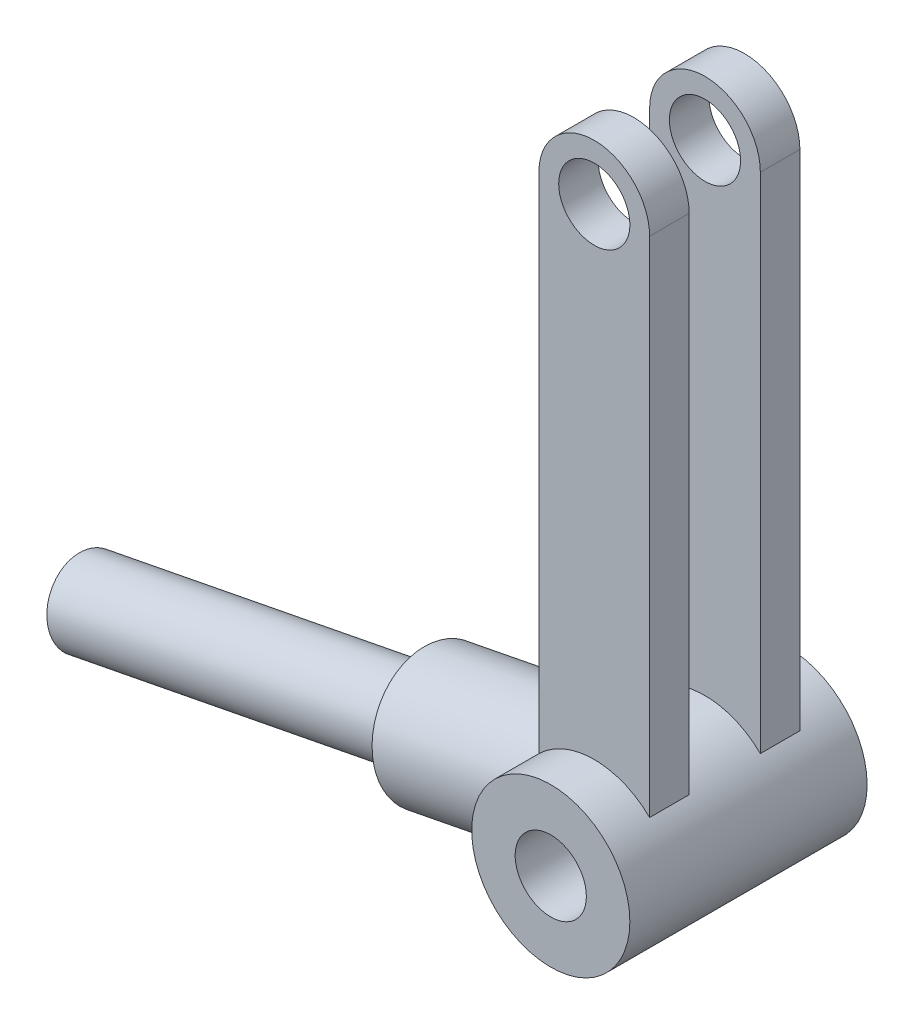
ISO-10303-21;
HEADER;
FILE_DESCRIPTION(('STEP AP214'),'2;1');
FILE_NAME('part.step','',(''),(''),'','','');
FILE_SCHEMA(('AUTOMOTIVE_DESIGN { 1 0 10303 214 1 1 1 1 }'));
ENDSEC;
DATA;
#1=APPLICATION_CONTEXT('core data for automotive mechanical design processes');
#2=APPLICATION_PROTOCOL_DEFINITION('international standard','automotive_design',2000,#1);
#3=PRODUCT_CONTEXT('',#1,'mechanical');
#4=PRODUCT('Part','Part','',(#3));
#5=PRODUCT_RELATED_PRODUCT_CATEGORY('part','',(#4));
#6=PRODUCT_DEFINITION_FORMATION('','',#4);
#7=PRODUCT_DEFINITION_CONTEXT('part definition',#1,'design');
#8=PRODUCT_DEFINITION('design','',#6,#7);
#9=PRODUCT_DEFINITION_SHAPE('','',#8);
#10=(LENGTH_UNIT() NAMED_UNIT(*) SI_UNIT(.MILLI.,.METRE.));
#11=(NAMED_UNIT(*) PLANE_ANGLE_UNIT() SI_UNIT($,.RADIAN.));
#12=(NAMED_UNIT(*) SI_UNIT($,.STERADIAN.) SOLID_ANGLE_UNIT());
#13=UNCERTAINTY_MEASURE_WITH_UNIT(LENGTH_MEASURE(1.E-05),#10,'distance_accuracy_value','');
#14=(GEOMETRIC_REPRESENTATION_CONTEXT(3) GLOBAL_UNCERTAINTY_ASSIGNED_CONTEXT((#13)) GLOBAL_UNIT_ASSIGNED_CONTEXT((#10,
#11,#12)) REPRESENTATION_CONTEXT('',''));
#15=CARTESIAN_POINT('',(0.,0.,0.));
#16=DIRECTION('',(0.,0.,1.));
#17=DIRECTION('',(1.,0.,0.));
#18=AXIS2_PLACEMENT_3D('',#15,#16,#17);
#19=CARTESIAN_POINT('',(0.,0.,30.));
#20=DIRECTION('',(0.,0.,-1.));
#21=DIRECTION('',(-1.,0.,0.));
#22=AXIS2_PLACEMENT_3D('',#19,#20,#21);
#23=CYLINDRICAL_SURFACE('',#22,10.);
#24=CARTESIAN_POINT('',(-10.,0.,22.7695384690661));
#25=CARTESIAN_POINT('',(-10.0000008713508,-0.17529619467171,22.8117621461201));
#26=CARTESIAN_POINT('',(-9.99538491016148,-0.351917556876541,22.8484527589088));
#27=CARTESIAN_POINT('',(-9.97657714419822,-0.706728604846986,22.9102653135046));
#28=CARTESIAN_POINT('',(-9.9623831625818,-0.884918638043774,22.935384623262));
#29=CARTESIAN_POINT('',(-9.92423856776875,-1.24164577145849,22.9736641372149));
#30=CARTESIAN_POINT('',(-9.90028253037817,-1.42018300962024,22.9868176795896));
#31=CARTESIAN_POINT('',(-9.842650298724,-1.77615916635452,23.0009305705847));
#32=CARTESIAN_POINT('',(-9.8089747109726,-1.95359815275386,23.0018906799225));
#33=CARTESIAN_POINT('',(-9.73215298359009,-2.30601784233769,22.9916036785103));
#34=CARTESIAN_POINT('',(-9.68900865494544,-2.48099900880359,22.9803589004403));
#35=CARTESIAN_POINT('',(-9.59368452275507,-2.82727225544033,22.9458472953437));
#36=CARTESIAN_POINT('',(-9.54150455043821,-2.99856426663655,22.9225802437444));
#37=CARTESIAN_POINT('',(-9.42872428643877,-3.3362931027347,22.8643875662852));
#38=CARTESIAN_POINT('',(-9.36812503743381,-3.50273052576514,22.8294633833422));
#39=CARTESIAN_POINT('',(-9.23921548470788,-3.82985965125223,22.748446149381));
#40=CARTESIAN_POINT('',(-9.1709022308768,-3.990549124342,22.7023488175735));
#41=CARTESIAN_POINT('',(-9.02711336128285,-4.30596996009885,22.5993860113559));
#42=CARTESIAN_POINT('',(-8.951610162432,-4.46067489010754,22.5424781600373));
#43=CARTESIAN_POINT('',(-8.79454882924568,-4.76287329261821,22.4186810420841));
#44=CARTESIAN_POINT('',(-8.71298836190038,-4.91036394982281,22.3517879194118));
#45=CARTESIAN_POINT('',(-8.4605566712773,-5.34130986454564,22.1371408482683));
#46=CARTESIAN_POINT('',(-8.28185664034492,-5.6134082587354,21.9753629042936));
#47=CARTESIAN_POINT('',(-7.96482654651766,-6.05078945014325,21.6714658293236));
#48=CARTESIAN_POINT('',(-7.82980705179049,-6.22417400779912,21.5372384904002));
#49=CARTESIAN_POINT('',(-7.55522663460297,-6.55474372512396,21.2540596893678));
#50=CARTESIAN_POINT('',(-7.41566410277533,-6.71192306009884,21.1051029704586));
#51=CARTESIAN_POINT('',(-7.13403566855849,-7.01054891232911,20.7933137235266));
#52=CARTESIAN_POINT('',(-6.9919640336966,-7.15195189244408,20.6304448855444));
#53=CARTESIAN_POINT('',(-6.70807700729393,-7.41887085309065,20.2920311611804));
#54=CARTESIAN_POINT('',(-6.56626158655218,-7.54438877358712,20.1164878267934));
#55=CARTESIAN_POINT('',(-6.28329029760688,-7.78170087403061,19.7504121427658));
#56=CARTESIAN_POINT('',(-6.14217733886124,-7.89325703298718,19.5596922863668));
#57=CARTESIAN_POINT('',(-5.86586947889627,-8.10070469147971,19.1657247364899));
#58=CARTESIAN_POINT('',(-5.73067640530859,-8.1965913780324,18.9624732201328));
#59=CARTESIAN_POINT('',(-5.47036029044761,-8.37255999402882,18.5438411416445));
#60=CARTESIAN_POINT('',(-5.34521153632514,-8.45268309454053,18.3284941158626));
#61=CARTESIAN_POINT('',(-5.10946878052453,-8.59723360761359,17.8851481832159));
#62=CARTESIAN_POINT('',(-4.99886286830685,-8.66167390161963,17.6571598498891));
#63=CARTESIAN_POINT('',(-4.78220344844867,-8.78341379252173,17.1509777303338));
#64=CARTESIAN_POINT('',(-4.67963877442209,-8.83797063256333,16.87054762777));
#65=CARTESIAN_POINT('',(-4.55503065066955,-8.90246516577482,16.4392455230193));
#66=CARTESIAN_POINT('',(-4.51838213190212,-8.92106673845354,16.2938002022062));
#67=CARTESIAN_POINT('',(-4.45612033545324,-8.95232984656299,15.9999667700434));
#68=CARTESIAN_POINT('',(-4.43050148483691,-8.96499438207489,15.8515801845598));
#69=CARTESIAN_POINT('',(-4.39120385214074,-8.98430964699575,15.5513704338279));
#70=CARTESIAN_POINT('',(-4.37764241500775,-8.99090129589038,15.3995279358676));
#71=CARTESIAN_POINT('',(-4.36354109660999,-8.99775376389309,15.095095940402));
#72=CARTESIAN_POINT('',(-4.36300051370624,-8.99801492412453,14.9425064835904));
#73=CARTESIAN_POINT('',(-4.37497166565391,-8.99220025497977,14.6378718849848));
#74=CARTESIAN_POINT('',(-4.38749161096521,-8.98612043936961,14.4858271459547));
#75=CARTESIAN_POINT('',(-4.42498199823403,-8.9677178384109,14.1836680295432));
#76=CARTESIAN_POINT('',(-4.44995413688061,-8.95539420229915,14.033553918082));
#77=CARTESIAN_POINT('',(-4.51559915308626,-8.92249374149397,13.7151967835545));
#78=CARTESIAN_POINT('',(-4.55799812911709,-8.90099338507433,13.5474067310459));
#79=CARTESIAN_POINT('',(-4.65553768918871,-8.85036593564297,13.2166803155041));
#80=CARTESIAN_POINT('',(-4.71068764317239,-8.8212332319625,13.0537476217472));
#81=CARTESIAN_POINT('',(-4.83166668323684,-8.75555469699807,12.7330188975657));
#82=CARTESIAN_POINT('',(-4.89752081602165,-8.71899142746229,12.5752359828342));
#83=CARTESIAN_POINT('',(-5.03774574158837,-8.63872957612866,12.2654717905084));
#84=CARTESIAN_POINT('',(-5.11211445741234,-8.59503273331685,12.1134891100751));
#85=CARTESIAN_POINT('',(-5.30596644156261,-8.47733018548019,11.741647684844));
#86=CARTESIAN_POINT('',(-5.42960107313917,-8.39900942157227,11.5253084664372));
#87=CARTESIAN_POINT('',(-5.68701089692071,-8.2269022344793,11.1051497352199));
#88=CARTESIAN_POINT('',(-5.82079081439799,-8.13310858043381,10.9013361373516));
#89=CARTESIAN_POINT('',(-6.09481328741082,-7.9298419251288,10.5058544506743));
#90=CARTESIAN_POINT('',(-6.23506330852133,-7.82035048760777,10.3142010306427));
#91=CARTESIAN_POINT('',(-6.51873327359071,-7.5855143938851,9.94342852925229));
#92=CARTESIAN_POINT('',(-6.66215269167951,-7.46017235157651,9.76430738876696));
#93=CARTESIAN_POINT('',(-6.95358900696225,-7.18945594877103,9.41409219256546));
#94=CARTESIAN_POINT('',(-7.10162063102045,-7.04361316668093,9.24337142397702));
#95=CARTESIAN_POINT('',(-7.39554048849039,-6.73435183107492,8.91650927576972));
#96=CARTESIAN_POINT('',(-7.54142840763196,-6.57093072920212,8.76037001620161));
#97=CARTESIAN_POINT('',(-7.82806148790179,-6.22667766437973,8.46437312353165));
#98=CARTESIAN_POINT('',(-7.96881736664678,-6.04588523839757,8.32448004645271));
#99=CARTESIAN_POINT('',(-8.24278013361307,-5.66667667332908,8.062339328168));
#100=CARTESIAN_POINT('',(-8.3759902876404,-5.46826825543078,7.94008401730591));
#101=CARTESIAN_POINT('',(-8.595968337188,-5.11271939241898,7.74691602120237));
#102=CARTESIAN_POINT('',(-8.68524755446658,-4.95969988027991,7.67124203388311));
#103=CARTESIAN_POINT('',(-8.85739626425282,-4.64528048721869,7.53084046539792));
#104=CARTESIAN_POINT('',(-8.9402673304636,-4.48388268020063,7.46611019203062));
#105=CARTESIAN_POINT('',(-9.09850908692532,-4.15339382218525,7.34842396112314));
#106=CARTESIAN_POINT('',(-9.17388342620976,-3.98430657301154,7.29546225958064));
#107=CARTESIAN_POINT('',(-9.31615949062089,-3.63923020027029,7.20203161553908));
#108=CARTESIAN_POINT('',(-9.38306100631448,-3.46324090623726,7.16156298181089));
#109=CARTESIAN_POINT('',(-9.50780313833684,-3.10450245758034,7.09358461147874));
#110=CARTESIAN_POINT('',(-9.56559195857693,-2.92172147824642,7.06614728729418));
#111=CARTESIAN_POINT('',(-9.67087742929667,-2.5516911217185,7.02504635954941));
#112=CARTESIAN_POINT('',(-9.71837409327951,-2.36444175038734,7.01138273791817));
#113=CARTESIAN_POINT('',(-9.80249814896726,-1.98705763571259,6.99808286283968));
#114=CARTESIAN_POINT('',(-9.83912739974179,-1.79692339173567,6.99844420876963));
#115=CARTESIAN_POINT('',(-9.90121344711317,-1.41538780902185,7.0131825591671));
#116=CARTESIAN_POINT('',(-9.92667086463449,-1.22398654130582,7.02755878455207));
#117=CARTESIAN_POINT('',(-9.96469293819656,-0.857817956466264,7.06824994194702));
#118=CARTESIAN_POINT('',(-9.9781690409072,-0.683018684843411,7.09344706887673));
#119=CARTESIAN_POINT('',(-9.99591189890287,-0.334866678476839,7.1549879999529));
#120=CARTESIAN_POINT('',(-10.0001755517545,-0.161514450618628,7.19133555447202));
#121=CARTESIAN_POINT('',(-9.99981337834475,0.182557230763853,7.27467003006927));
#122=CARTESIAN_POINT('',(-9.99518917809035,0.353277160099765,7.32165500367515));
#123=CARTESIAN_POINT('',(-9.97751745720482,0.691227349828502,7.42570301021074));
#124=CARTESIAN_POINT('',(-9.96446665770152,0.858456225658765,7.48276995985464));
#125=CARTESIAN_POINT('',(-9.92952970007577,1.19799642360515,7.60988017082685));
#126=CARTESIAN_POINT('',(-9.90718149214308,1.37005252443971,7.68047840740621));
#127=CARTESIAN_POINT('',(-9.85445336843753,1.70854905241921,7.83148093049721));
#128=CARTESIAN_POINT('',(-9.82407068357571,1.87498752109849,7.91188859267875));
#129=CARTESIAN_POINT('',(-9.72206599158375,2.3648365035395,8.16670809030124));
#130=CARTESIAN_POINT('',(-9.63955661885622,2.67905768265391,8.35482163631224));
#131=CARTESIAN_POINT('',(-9.49045330470962,3.15693359796329,8.67935740111833));
#132=CARTESIAN_POINT('',(-9.43100114214492,3.32991735064331,8.80575261970784));
#133=CARTESIAN_POINT('',(-9.30570855566501,3.66548897854205,9.06879821907875));
#134=CARTESIAN_POINT('',(-9.23986873379384,3.82807783110004,9.20544763311629));
#135=CARTESIAN_POINT('',(-9.10308508139966,4.14287227841428,9.4887654373006));
#136=CARTESIAN_POINT('',(-9.03212734889073,4.29504722235486,9.63546105732116));
#137=CARTESIAN_POINT('',(-8.88684647172838,4.5881040890374,9.93808440932452));
#138=CARTESIAN_POINT('',(-8.81252407726402,4.72898850991092,10.0940100857243));
#139=CARTESIAN_POINT('',(-8.64598899507624,5.02813283131916,10.4494631566853));
#140=CARTESIAN_POINT('',(-8.55336774165964,5.18360903284778,10.6511534311002));
#141=CARTESIAN_POINT('',(-8.36902214538181,5.47625590879746,11.0679895355692));
#142=CARTESIAN_POINT('',(-8.27729828300755,5.61341722611179,11.2831421617537));
#143=CARTESIAN_POINT('',(-8.09931681144938,5.86728302985924,11.726433009977));
#144=CARTESIAN_POINT('',(-8.01304275931661,5.98405113310217,11.9545277979366));
#145=CARTESIAN_POINT('',(-7.85104758779026,6.19505546591143,12.42422846133));
#146=CARTESIAN_POINT('',(-7.77531424812967,6.2893178795109,12.6658182281721));
#147=CARTESIAN_POINT('',(-7.6350155351128,6.45908745027308,13.1840083482036));
#148=CARTESIAN_POINT('',(-7.57197879098415,6.53227284241821,13.4618306096399));
#149=CARTESIAN_POINT('',(-7.49938668708962,6.615173549174,13.8871360833597));
#150=CARTESIAN_POINT('',(-7.47885669786076,6.63832055804951,14.0302274725606));
#151=CARTESIAN_POINT('',(-7.44598670436462,6.67517069863425,14.3185282120449));
#152=CARTESIAN_POINT('',(-7.43364299629914,6.68887810130352,14.4637365740929));
#153=CARTESIAN_POINT('',(-7.41772220361371,6.70652975845727,14.7561767618126));
#154=CARTESIAN_POINT('',(-7.4142024069636,6.71041021455452,14.903415601565));
#155=CARTESIAN_POINT('',(-7.41628351280096,6.70811009949707,15.1977458796467));
#156=CARTESIAN_POINT('',(-7.42188420098424,6.70192976474094,15.344837321358));
#157=CARTESIAN_POINT('',(-7.44191561845048,6.67967906677952,15.6378114591525));
#158=CARTESIAN_POINT('',(-7.45635583070116,6.66359808213266,15.7836926863452));
#159=CARTESIAN_POINT('',(-7.49334910348755,6.62197011805406,16.0731070493832));
#160=CARTESIAN_POINT('',(-7.51590652210167,6.59641805343562,16.2166388804903));
#161=CARTESIAN_POINT('',(-7.57457954943902,6.52902770120219,16.5356191037332));
#162=CARTESIAN_POINT('',(-7.6126684772304,6.48472463315189,16.7101835944724));
#163=CARTESIAN_POINT('',(-7.69766770633869,6.38359328115825,17.0534549496091));
#164=CARTESIAN_POINT('',(-7.74458237616636,6.3267587920831,17.2221588639755));
#165=CARTESIAN_POINT('',(-7.84513830362452,6.20163332871042,17.5536457022245));
#166=CARTESIAN_POINT('',(-7.89879531091899,6.13331539937004,17.7164135722066));
#167=CARTESIAN_POINT('',(-8.01074733825677,5.98635673726626,18.0354831824583));
#168=CARTESIAN_POINT('',(-8.06904164465546,5.9077175916527,18.1917859120574));
#169=CARTESIAN_POINT('',(-8.21634614841058,5.7021226489335,18.5692644112977));
#170=CARTESIAN_POINT('',(-8.30703730409916,5.56970044816047,18.7868190258172));
#171=CARTESIAN_POINT('',(-8.49025502340598,5.28621823964056,19.2086475275157));
#172=CARTESIAN_POINT('',(-8.5827823539831,5.13515030006201,19.4129157058786));
#173=CARTESIAN_POINT('',(-8.76619582681124,4.81537512138558,19.8084590953548));
#174=CARTESIAN_POINT('',(-8.85707953459997,4.64664388757238,19.9997160342522));
#175=CARTESIAN_POINT('',(-9.03398409411145,4.29258662938506,20.3685725193733));
#176=CARTESIAN_POINT('',(-9.12000581922832,4.10726360107345,20.5461745206135));
#177=CARTESIAN_POINT('',(-9.28582825640437,3.71739516013447,20.889901700054));
#178=CARTESIAN_POINT('',(-9.3654989634372,3.51257739202937,21.0557816181933));
#179=CARTESIAN_POINT('',(-9.51421633814421,3.08714609736817,21.371466074432));
#180=CARTESIAN_POINT('',(-9.58326034476946,2.86652863458578,21.5212665832284));
#181=CARTESIAN_POINT('',(-9.70772291519475,2.41153596138034,21.8024221765766));
#182=CARTESIAN_POINT('',(-9.76319891524077,2.17722413683652,21.9338539691872));
#183=CARTESIAN_POINT('',(-9.85824781801137,1.69560793436055,22.176862117605));
#184=CARTESIAN_POINT('',(-9.89783547450603,1.44831585224846,22.2884568400271));
#185=CARTESIAN_POINT('',(-9.95159288622958,1.00193292451872,22.4660530380863));
#186=CARTESIAN_POINT('',(-9.96954229341588,0.80509906061581,22.5366133095801));
#187=CARTESIAN_POINT('',(-9.9937483408656,0.406109857217613,22.663796616044));
#188=CARTESIAN_POINT('',(-9.9999989862096,0.203951843187889,22.7204124924443));
#189=CARTESIAN_POINT('',(-10.,0.,22.7695384690661));
#190=B_SPLINE_CURVE_WITH_KNOTS('',3,(#24,#25,#26,#27,#28,#29,#30,#31,#32,#33,#34,#35,#36,#37,
#38,#39,#40,#41,#42,#43,#44,#45,#46,#47,#48,#49,#50,#51,#52,#53,#54,#55,#56,#57,#58,#59,#60,#61,
#62,#63,#64,#65,#66,#67,#68,#69,#70,#71,#72,#73,#74,#75,#76,#77,#78,#79,#80,#81,#82,#83,#84,#85,
#86,#87,#88,#89,#90,#91,#92,#93,#94,#95,#96,#97,#98,#99,#100,#101,#102,#103,#104,#105,#106,#107,
#108,#109,#110,#111,#112,#113,#114,#115,#116,#117,#118,#119,#120,#121,#122,#123,#124,#125,#126,
#127,#128,#129,#130,#131,#132,#133,#134,#135,#136,#137,#138,#139,#140,#141,#142,#143,#144,#145,
#146,#147,#148,#149,#150,#151,#152,#153,#154,#155,#156,#157,#158,#159,#160,#161,#162,#163,#164,
#165,#166,#167,#168,#169,#170,#171,#172,#173,#174,#175,#176,#177,#178,#179,#180,#181,#182,#183,
#184,#185,#186,#187,#188,#189),.UNSPECIFIED.,.T.,.F.,(4,2,2,2,2,2,2,2,2,2,2,2,2,2,2,2,2,2,2,2,2,
2,2,2,2,2,2,2,2,2,2,2,2,2,2,2,2,2,2,2,2,2,2,2,2,2,2,2,2,2,2,2,2,2,2,2,2,2,2,2,2,2,2,2,2,2,2,2,2,
2,2,2,2,2,2,2,2,2,2,2,2,2,4),(0.,0.540756751606782,1.08163644499626,1.62281708375389,
2.16396395945559,2.70500742574428,3.24606099893595,3.7870476254731,4.32824184976703,
4.87160303127774,5.41517458942062,6.50173877442633,7.2733851263178,8.04530787357613,
8.8193107477489,9.59321900532148,10.3789092181144,11.1648403091449,11.9486906441238,
12.7318949555063,13.6390117439602,14.0919803884871,14.5447198932263,15.001818779594,
15.4588930347733,15.9162548014995,16.3736789036566,16.8960642292111,17.418834651944,
17.9428463957608,18.4667305888993,19.2491654098579,20.0319669230144,20.8156954453289,
21.5992948925936,22.405184968489,23.2111920334096,24.0154062318692,24.8192696626286,
25.3966683189939,25.9739247254335,26.5508987627819,27.1278870591193,27.7080451023791,
28.2882023844737,28.8682603627621,29.4482860976566,29.9790440555257,30.5099807264161,
31.0408202732299,31.5718664994816,32.1332428249527,32.6948128819624,33.8170670770617,
34.4836217259406,35.1501136122174,35.818489550012,36.4867171928578,37.2987226791533,
38.1111414460063,38.9209787489182,39.7298692121846,40.6085934593998,41.0473261675154,
41.485860239892,41.9272341429262,42.3685976751403,42.8104355302929,43.2525109602889,
43.8038986219799,44.3555599276314,44.9085347070618,45.4614245519492,46.2713433219935,
47.081607823843,47.8929876762243,48.7042213081064,49.5291915506405,50.3543680403503,
51.1759884528169,51.996844141001,52.6256761849043,53.2548303796833),.UNSPECIFIED.);
#191=CARTESIAN_POINT('',(-10.,0.,22.7695384690661));
#192=VERTEX_POINT('',#191);
#193=EDGE_CURVE('E227',#192,#192,#190,.T.);
#194=ORIENTED_EDGE('',*,*,#193,.T.);
#195=EDGE_LOOP('',(#194));
#196=FACE_BOUND('',#195,.T.);
#197=CARTESIAN_POINT('',(0.,0.,10.5));
#198=DIRECTION('',(0.,0.,-1.));
#199=DIRECTION('',(-1.,0.,0.));
#200=AXIS2_PLACEMENT_3D('',#197,#198,#199);
#201=CIRCLE('',#200,10.);
#202=CARTESIAN_POINT('',(-7.,7.14142842854285,10.5));
#203=VERTEX_POINT('',#202);
#204=CARTESIAN_POINT('',(7.,7.14142842854285,10.5));
#205=VERTEX_POINT('',#204);
#206=EDGE_CURVE('E168',#203,#205,#201,.T.);
#207=ORIENTED_EDGE('',*,*,#206,.F.);
#208=DIRECTION('',(0.,0.,-1.));
#209=VECTOR('',#208,1.);
#210=CARTESIAN_POINT('',(-7.,7.14142842854285,30.));
#211=LINE('',#210,#209);
#212=CARTESIAN_POINT('',(-7.,7.14142842854285,5.50000000000001));
#213=VERTEX_POINT('',#212);
#214=EDGE_CURVE('E185',#213,#203,#211,.F.);
#215=ORIENTED_EDGE('',*,*,#214,.F.);
#216=CARTESIAN_POINT('',(0.,0.,5.50000000000001));
#217=DIRECTION('',(0.,0.,1.));
#218=DIRECTION('',(1.,0.,0.));
#219=AXIS2_PLACEMENT_3D('',#216,#217,#218);
#220=CIRCLE('',#219,10.);
#221=CARTESIAN_POINT('',(7.,7.14142842854285,5.5));
#222=VERTEX_POINT('',#221);
#223=EDGE_CURVE('E149',#222,#213,#220,.T.);
#224=ORIENTED_EDGE('',*,*,#223,.F.);
#225=DIRECTION('',(0.,0.,-1.));
#226=VECTOR('',#225,1.);
#227=CARTESIAN_POINT('',(7.,7.14142842854285,30.));
#228=LINE('',#227,#226);
#229=EDGE_CURVE('E190',#205,#222,#228,.T.);
#230=ORIENTED_EDGE('',*,*,#229,.F.);
#231=EDGE_LOOP('',(#207,#215,#224,#230));
#232=FACE_BOUND('',#231,.T.);
#233=CARTESIAN_POINT('',(0.,0.,30.));
#234=DIRECTION('',(0.,0.,1.));
#235=DIRECTION('',(1.,0.,0.));
#236=AXIS2_PLACEMENT_3D('',#233,#234,#235);
#237=CIRCLE('',#236,10.);
#238=CARTESIAN_POINT('',(10.,0.,30.));
#239=VERTEX_POINT('',#238);
#240=EDGE_CURVE('E182',#239,#239,#237,.T.);
#241=ORIENTED_EDGE('',*,*,#240,.F.);
#242=EDGE_LOOP('',(#241));
#243=FACE_BOUND('',#242,.T.);
#244=CARTESIAN_POINT('',(0.,0.,0.));
#245=DIRECTION('',(0.,0.,1.));
#246=DIRECTION('',(1.,0.,0.));
#247=AXIS2_PLACEMENT_3D('',#244,#245,#246);
#248=CIRCLE('',#247,10.);
#249=CARTESIAN_POINT('',(10.,0.,0.));
#250=VERTEX_POINT('',#249);
#251=EDGE_CURVE('E179',#250,#250,#248,.T.);
#252=ORIENTED_EDGE('',*,*,#251,.T.);
#253=EDGE_LOOP('',(#252));
#254=FACE_BOUND('',#253,.T.);
#255=DIRECTION('',(0.,0.,-1.));
#256=VECTOR('',#255,1.);
#257=CARTESIAN_POINT('',(-7.,7.14142842854285,30.));
#258=LINE('',#257,#256);
#259=CARTESIAN_POINT('',(-7.,7.14142842854285,19.5));
#260=VERTEX_POINT('',#259);
#261=CARTESIAN_POINT('',(-7.,7.14142842854285,24.5));
#262=VERTEX_POINT('',#261);
#263=EDGE_CURVE('E50',#260,#262,#258,.F.);
#264=ORIENTED_EDGE('',*,*,#263,.F.);
#265=CARTESIAN_POINT('',(0.,0.,19.5));
#266=DIRECTION('',(0.,0.,1.));
#267=DIRECTION('',(1.,0.,0.));
#268=AXIS2_PLACEMENT_3D('',#265,#266,#267);
#269=CIRCLE('',#268,10.);
#270=CARTESIAN_POINT('',(7.,7.14142842854285,19.5));
#271=VERTEX_POINT('',#270);
#272=EDGE_CURVE('E171',#271,#260,#269,.T.);
#273=ORIENTED_EDGE('',*,*,#272,.F.);
#274=DIRECTION('',(0.,0.,-1.));
#275=VECTOR('',#274,1.);
#276=CARTESIAN_POINT('',(7.,7.14142842854285,30.));
#277=LINE('',#276,#275);
#278=CARTESIAN_POINT('',(7.,7.14142842854285,24.5));
#279=VERTEX_POINT('',#278);
#280=EDGE_CURVE('E63',#279,#271,#277,.T.);
#281=ORIENTED_EDGE('',*,*,#280,.F.);
#282=CARTESIAN_POINT('',(0.,0.,24.5));
#283=DIRECTION('',(0.,0.,-1.));
#284=DIRECTION('',(-1.,0.,0.));
#285=AXIS2_PLACEMENT_3D('',#282,#283,#284);
#286=CIRCLE('',#285,10.);
#287=EDGE_CURVE('E58',#262,#279,#286,.T.);
#288=ORIENTED_EDGE('',*,*,#287,.F.);
#289=EDGE_LOOP('',(#264,#273,#281,#288));
#290=FACE_BOUND('',#289,.T.);
#291=ADVANCED_FACE('F41',(#196,#232,#243,#254,#290),#23,.T.);
#292=CARTESIAN_POINT('',(0.,0.,30.));
#293=DIRECTION('',(0.,0.,1.));
#294=DIRECTION('',(1.,0.,0.));
#295=AXIS2_PLACEMENT_3D('',#292,#293,#294);
#296=PLANE('',#295);
#297=CARTESIAN_POINT('',(0.,0.,30.));
#298=DIRECTION('',(0.,0.,1.));
#299=DIRECTION('',(1.,0.,0.));
#300=AXIS2_PLACEMENT_3D('',#297,#298,#299);
#301=CIRCLE('',#300,4.5);
#302=CARTESIAN_POINT('',(4.5,0.,30.));
#303=VERTEX_POINT('',#302);
#304=EDGE_CURVE('E175',#303,#303,#301,.T.);
#305=ORIENTED_EDGE('',*,*,#304,.F.);
#306=EDGE_LOOP('',(#305));
#307=FACE_BOUND('',#306,.T.);
#308=ORIENTED_EDGE('',*,*,#240,.T.);
#309=EDGE_LOOP('',(#308));
#310=FACE_BOUND('',#309,.T.);
#311=ADVANCED_FACE('F214',(#307,#310),#296,.T.);
#312=CARTESIAN_POINT('',(0.,0.,0.));
#313=DIRECTION('',(0.,0.,1.));
#314=DIRECTION('',(1.,0.,0.));
#315=AXIS2_PLACEMENT_3D('',#312,#313,#314);
#316=PLANE('',#315);
#317=CARTESIAN_POINT('',(0.,0.,0.));
#318=DIRECTION('',(0.,0.,1.));
#319=DIRECTION('',(1.,0.,0.));
#320=AXIS2_PLACEMENT_3D('',#317,#318,#319);
#321=CIRCLE('',#320,4.5);
#322=CARTESIAN_POINT('',(4.5,0.,0.));
#323=VERTEX_POINT('',#322);
#324=EDGE_CURVE('E176',#323,#323,#321,.T.);
#325=ORIENTED_EDGE('',*,*,#324,.T.);
#326=EDGE_LOOP('',(#325));
#327=FACE_BOUND('',#326,.T.);
#328=ORIENTED_EDGE('',*,*,#251,.F.);
#329=EDGE_LOOP('',(#328));
#330=FACE_BOUND('',#329,.T.);
#331=ADVANCED_FACE('F221',(#327,#330),#316,.F.);
#332=CARTESIAN_POINT('',(0.,0.,0.));
#333=DIRECTION('',(0.,0.,1.));
#334=DIRECTION('',(1.,0.,0.));
#335=AXIS2_PLACEMENT_3D('',#332,#333,#334);
#336=CYLINDRICAL_SURFACE('',#335,4.5);
#337=ORIENTED_EDGE('',*,*,#324,.F.);
#338=EDGE_LOOP('',(#337));
#339=FACE_BOUND('',#338,.T.);
#340=ORIENTED_EDGE('',*,*,#304,.T.);
#341=EDGE_LOOP('',(#340));
#342=FACE_BOUND('',#341,.T.);
#343=ADVANCED_FACE('F234',(#339,#342),#336,.F.);
#344=CARTESIAN_POINT('',(7.,70.8,10.5));
#345=DIRECTION('',(-1.,0.,0.));
#346=DIRECTION('',(0.,0.,1.));
#347=AXIS2_PLACEMENT_3D('',#344,#345,#346);
#348=PLANE('',#347);
#349=DIRECTION('',(0.,-1.,0.));
#350=VECTOR('',#349,1.);
#351=CARTESIAN_POINT('',(7.,70.8,10.5));
#352=LINE('',#351,#350);
#353=CARTESIAN_POINT('',(7.,70.8,10.5));
#354=VERTEX_POINT('',#353);
#355=EDGE_CURVE('E139',#354,#205,#352,.T.);
#356=ORIENTED_EDGE('',*,*,#355,.T.);
#357=ORIENTED_EDGE('',*,*,#229,.T.);
#358=DIRECTION('',(0.,-1.,0.));
#359=VECTOR('',#358,1.);
#360=CARTESIAN_POINT('',(7.,70.8,5.5));
#361=LINE('',#360,#359);
#362=CARTESIAN_POINT('',(7.,70.8,5.5));
#363=VERTEX_POINT('',#362);
#364=EDGE_CURVE('E152',#363,#222,#361,.T.);
#365=ORIENTED_EDGE('',*,*,#364,.F.);
#366=DIRECTION('',(0.,0.,-1.));
#367=VECTOR('',#366,1.);
#368=CARTESIAN_POINT('',(7.,70.8,10.5));
#369=LINE('',#368,#367);
#370=EDGE_CURVE('E142',#354,#363,#369,.T.);
#371=ORIENTED_EDGE('',*,*,#370,.F.);
#372=EDGE_LOOP('',(#356,#357,#365,#371));
#373=FACE_BOUND('',#372,.T.);
#374=ADVANCED_FACE('F239',(#373),#348,.F.);
#375=CARTESIAN_POINT('',(-7.,70.8,5.5));
#376=DIRECTION('',(1.,0.,0.));
#377=DIRECTION('',(0.,0.,-1.));
#378=AXIS2_PLACEMENT_3D('',#375,#376,#377);
#379=PLANE('',#378);
#380=DIRECTION('',(0.,-1.,0.));
#381=VECTOR('',#380,1.);
#382=CARTESIAN_POINT('',(-7.,70.8,5.5));
#383=LINE('',#382,#381);
#384=CARTESIAN_POINT('',(-7.,70.8,5.5));
#385=VERTEX_POINT('',#384);
#386=EDGE_CURVE('E155',#385,#213,#383,.T.);
#387=ORIENTED_EDGE('',*,*,#386,.T.);
#388=ORIENTED_EDGE('',*,*,#214,.T.);
#389=DIRECTION('',(0.,-1.,0.));
#390=VECTOR('',#389,1.);
#391=CARTESIAN_POINT('',(-7.,70.8,10.5));
#392=LINE('',#391,#390);
#393=CARTESIAN_POINT('',(-7.,70.8,10.5));
#394=VERTEX_POINT('',#393);
#395=EDGE_CURVE('E158',#394,#203,#392,.T.);
#396=ORIENTED_EDGE('',*,*,#395,.F.);
#397=DIRECTION('',(0.,0.,1.));
#398=VECTOR('',#397,1.);
#399=CARTESIAN_POINT('',(-7.,70.8,5.5));
#400=LINE('',#399,#398);
#401=EDGE_CURVE('E161',#385,#394,#400,.T.);
#402=ORIENTED_EDGE('',*,*,#401,.F.);
#403=EDGE_LOOP('',(#387,#388,#396,#402));
#404=FACE_BOUND('',#403,.T.);
#405=ADVANCED_FACE('F243',(#404),#379,.F.);
#406=CARTESIAN_POINT('',(0.,70.8,10.5));
#407=DIRECTION('',(0.,0.,-1.));
#408=DIRECTION('',(-1.,0.,0.));
#409=AXIS2_PLACEMENT_3D('',#406,#407,#408);
#410=PLANE('',#409);
#411=CARTESIAN_POINT('',(0.,70.8,10.5));
#412=DIRECTION('',(0.,0.,-1.));
#413=DIRECTION('',(-1.,0.,0.));
#414=AXIS2_PLACEMENT_3D('',#411,#412,#413);
#415=CIRCLE('',#414,4.50000000000001);
#416=CARTESIAN_POINT('',(-4.50000000000001,70.8,10.5));
#417=VERTEX_POINT('',#416);
#418=EDGE_CURVE('E128',#417,#417,#415,.T.);
#419=ORIENTED_EDGE('',*,*,#418,.T.);
#420=EDGE_LOOP('',(#419));
#421=FACE_BOUND('',#420,.T.);
#422=ORIENTED_EDGE('',*,*,#395,.T.);
#423=ORIENTED_EDGE('',*,*,#206,.T.);
#424=ORIENTED_EDGE('',*,*,#355,.F.);
#425=CARTESIAN_POINT('',(0.,70.8,10.5));
#426=DIRECTION('',(0.,0.,-1.));
#427=DIRECTION('',(-1.,0.,0.));
#428=AXIS2_PLACEMENT_3D('',#425,#426,#427);
#429=CIRCLE('',#428,7.);
#430=EDGE_CURVE('E136',#394,#354,#429,.T.);
#431=ORIENTED_EDGE('',*,*,#430,.F.);
#432=EDGE_LOOP('',(#422,#423,#424,#431));
#433=FACE_BOUND('',#432,.T.);
#434=ADVANCED_FACE('F246',(#421,#433),#410,.F.);
#435=CARTESIAN_POINT('',(7.,70.8,5.5));
#436=DIRECTION('',(0.,0.,1.));
#437=DIRECTION('',(1.,0.,0.));
#438=AXIS2_PLACEMENT_3D('',#435,#436,#437);
#439=PLANE('',#438);
#440=CARTESIAN_POINT('',(0.,70.8,5.5));
#441=DIRECTION('',(0.,0.,-1.));
#442=DIRECTION('',(-1.,0.,0.));
#443=AXIS2_PLACEMENT_3D('',#440,#441,#442);
#444=CIRCLE('',#443,4.50000000000001);
#445=CARTESIAN_POINT('',(-4.50000000000001,70.8,5.5));
#446=VERTEX_POINT('',#445);
#447=EDGE_CURVE('E420',#446,#446,#444,.T.);
#448=ORIENTED_EDGE('',*,*,#447,.F.);
#449=EDGE_LOOP('',(#448));
#450=FACE_BOUND('',#449,.T.);
#451=ORIENTED_EDGE('',*,*,#364,.T.);
#452=ORIENTED_EDGE('',*,*,#223,.T.);
#453=ORIENTED_EDGE('',*,*,#386,.F.);
#454=CARTESIAN_POINT('',(0.,70.8,5.5));
#455=DIRECTION('',(0.,0.,-1.));
#456=DIRECTION('',(-1.,0.,0.));
#457=AXIS2_PLACEMENT_3D('',#454,#455,#456);
#458=CIRCLE('',#457,7.);
#459=EDGE_CURVE('E130',#385,#363,#458,.T.);
#460=ORIENTED_EDGE('',*,*,#459,.T.);
#461=EDGE_LOOP('',(#451,#452,#453,#460));
#462=FACE_BOUND('',#461,.T.);
#463=ADVANCED_FACE('F248',(#450,#462),#439,.F.);
#464=CARTESIAN_POINT('',(-7.,70.8,24.5));
#465=DIRECTION('',(1.,0.,0.));
#466=DIRECTION('',(0.,0.,-1.));
#467=AXIS2_PLACEMENT_3D('',#464,#465,#466);
#468=PLANE('',#467);
#469=DIRECTION('',(0.,-1.,0.));
#470=VECTOR('',#469,1.);
#471=CARTESIAN_POINT('',(-7.,70.8,19.5));
#472=LINE('',#471,#470);
#473=CARTESIAN_POINT('',(-7.,70.8,19.5));
#474=VERTEX_POINT('',#473);
#475=EDGE_CURVE('E146',#474,#260,#472,.T.);
#476=ORIENTED_EDGE('',*,*,#475,.T.);
#477=ORIENTED_EDGE('',*,*,#263,.T.);
#478=DIRECTION('',(0.,-1.,0.));
#479=VECTOR('',#478,1.);
#480=CARTESIAN_POINT('',(-7.,70.8,24.5));
#481=LINE('',#480,#479);
#482=CARTESIAN_POINT('',(-7.,70.8,24.5));
#483=VERTEX_POINT('',#482);
#484=EDGE_CURVE('E123',#483,#262,#481,.T.);
#485=ORIENTED_EDGE('',*,*,#484,.F.);
#486=DIRECTION('',(0.,0.,1.));
#487=VECTOR('',#486,1.);
#488=CARTESIAN_POINT('',(-7.,70.8,24.5));
#489=LINE('',#488,#487);
#490=EDGE_CURVE('E116',#474,#483,#489,.T.);
#491=ORIENTED_EDGE('',*,*,#490,.F.);
#492=EDGE_LOOP('',(#476,#477,#485,#491));
#493=FACE_BOUND('',#492,.T.);
#494=ADVANCED_FACE('F194',(#493),#468,.F.);
#495=CARTESIAN_POINT('',(7.,70.8,19.5));
#496=DIRECTION('',(-1.,0.,0.));
#497=DIRECTION('',(0.,0.,1.));
#498=AXIS2_PLACEMENT_3D('',#495,#496,#497);
#499=PLANE('',#498);
#500=DIRECTION('',(0.,-1.,0.));
#501=VECTOR('',#500,1.);
#502=CARTESIAN_POINT('',(7.,70.8,24.5));
#503=LINE('',#502,#501);
#504=CARTESIAN_POINT('',(7.,70.8,24.5));
#505=VERTEX_POINT('',#504);
#506=EDGE_CURVE('E109',#505,#279,#503,.T.);
#507=ORIENTED_EDGE('',*,*,#506,.T.);
#508=ORIENTED_EDGE('',*,*,#280,.T.);
#509=DIRECTION('',(0.,-1.,0.));
#510=VECTOR('',#509,1.);
#511=CARTESIAN_POINT('',(7.,70.8,19.5));
#512=LINE('',#511,#510);
#513=CARTESIAN_POINT('',(7.,70.8,19.5));
#514=VERTEX_POINT('',#513);
#515=EDGE_CURVE('E111',#514,#271,#512,.T.);
#516=ORIENTED_EDGE('',*,*,#515,.F.);
#517=DIRECTION('',(0.,0.,-1.));
#518=VECTOR('',#517,1.);
#519=CARTESIAN_POINT('',(7.,70.8,19.5));
#520=LINE('',#519,#518);
#521=EDGE_CURVE('E106',#505,#514,#520,.T.);
#522=ORIENTED_EDGE('',*,*,#521,.F.);
#523=EDGE_LOOP('',(#507,#508,#516,#522));
#524=FACE_BOUND('',#523,.T.);
#525=ADVANCED_FACE('F108',(#524),#499,.F.);
#526=CARTESIAN_POINT('',(7.,70.8,24.5));
#527=DIRECTION('',(0.,0.,-1.));
#528=DIRECTION('',(-1.,0.,0.));
#529=AXIS2_PLACEMENT_3D('',#526,#527,#528);
#530=PLANE('',#529);
#531=CARTESIAN_POINT('',(0.,70.8,24.5));
#532=DIRECTION('',(0.,0.,-1.));
#533=DIRECTION('',(-1.,0.,0.));
#534=AXIS2_PLACEMENT_3D('',#531,#532,#533);
#535=CIRCLE('',#534,4.50000000000001);
#536=CARTESIAN_POINT('',(-4.5,70.8,24.5));
#537=VERTEX_POINT('',#536);
#538=EDGE_CURVE('E133',#537,#537,#535,.T.);
#539=ORIENTED_EDGE('',*,*,#538,.T.);
#540=EDGE_LOOP('',(#539));
#541=FACE_BOUND('',#540,.T.);
#542=ORIENTED_EDGE('',*,*,#484,.T.);
#543=ORIENTED_EDGE('',*,*,#287,.T.);
#544=ORIENTED_EDGE('',*,*,#506,.F.);
#545=CARTESIAN_POINT('',(0.,70.8,24.5));
#546=DIRECTION('',(0.,0.,1.));
#547=DIRECTION('',(1.,0.,0.));
#548=AXIS2_PLACEMENT_3D('',#545,#546,#547);
#549=CIRCLE('',#548,7.);
#550=EDGE_CURVE('E122',#505,#483,#549,.T.);
#551=ORIENTED_EDGE('',*,*,#550,.T.);
#552=EDGE_LOOP('',(#542,#543,#544,#551));
#553=FACE_BOUND('',#552,.T.);
#554=ADVANCED_FACE('F121',(#541,#553),#530,.F.);
#555=CARTESIAN_POINT('',(0.,70.8,19.5));
#556=DIRECTION('',(0.,0.,1.));
#557=DIRECTION('',(1.,0.,0.));
#558=AXIS2_PLACEMENT_3D('',#555,#556,#557);
#559=PLANE('',#558);
#560=CARTESIAN_POINT('',(0.,70.8,19.5));
#561=DIRECTION('',(0.,0.,1.));
#562=DIRECTION('',(1.,0.,0.));
#563=AXIS2_PLACEMENT_3D('',#560,#561,#562);
#564=CIRCLE('',#563,4.50000000000001);
#565=CARTESIAN_POINT('',(4.50000000000001,70.8,19.5));
#566=VERTEX_POINT('',#565);
#567=EDGE_CURVE('E45',#566,#566,#564,.T.);
#568=ORIENTED_EDGE('',*,*,#567,.T.);
#569=EDGE_LOOP('',(#568));
#570=FACE_BOUND('',#569,.T.);
#571=ORIENTED_EDGE('',*,*,#515,.T.);
#572=ORIENTED_EDGE('',*,*,#272,.T.);
#573=ORIENTED_EDGE('',*,*,#475,.F.);
#574=CARTESIAN_POINT('',(0.,70.8,19.5));
#575=DIRECTION('',(0.,0.,1.));
#576=DIRECTION('',(1.,0.,0.));
#577=AXIS2_PLACEMENT_3D('',#574,#575,#576);
#578=CIRCLE('',#577,7.);
#579=EDGE_CURVE('E127',#514,#474,#578,.T.);
#580=ORIENTED_EDGE('',*,*,#579,.F.);
#581=EDGE_LOOP('',(#571,#572,#573,#580));
#582=FACE_BOUND('',#581,.T.);
#583=ADVANCED_FACE('F197',(#570,#582),#559,.F.);
#584=CARTESIAN_POINT('',(0.,70.8,10.5));
#585=DIRECTION('',(0.,0.,-1.));
#586=DIRECTION('',(-1.,0.,0.));
#587=AXIS2_PLACEMENT_3D('',#584,#585,#586);
#588=CYLINDRICAL_SURFACE('',#587,7.);
#589=ORIENTED_EDGE('',*,*,#459,.F.);
#590=ORIENTED_EDGE('',*,*,#401,.T.);
#591=ORIENTED_EDGE('',*,*,#430,.T.);
#592=ORIENTED_EDGE('',*,*,#370,.T.);
#593=EDGE_LOOP('',(#589,#590,#591,#592));
#594=FACE_BOUND('',#593,.T.);
#595=ADVANCED_FACE('F199',(#594),#588,.T.);
#596=CARTESIAN_POINT('',(0.,70.8,19.5));
#597=DIRECTION('',(0.,0.,1.));
#598=DIRECTION('',(1.,0.,0.));
#599=AXIS2_PLACEMENT_3D('',#596,#597,#598);
#600=CYLINDRICAL_SURFACE('',#599,7.);
#601=ORIENTED_EDGE('',*,*,#550,.F.);
#602=ORIENTED_EDGE('',*,*,#521,.T.);
#603=ORIENTED_EDGE('',*,*,#579,.T.);
#604=ORIENTED_EDGE('',*,*,#490,.T.);
#605=EDGE_LOOP('',(#601,#602,#603,#604));
#606=FACE_BOUND('',#605,.T.);
#607=ADVANCED_FACE('F126',(#606),#600,.T.);
#608=CARTESIAN_POINT('',(0.,70.8,32.5));
#609=DIRECTION('',(0.,0.,-1.));
#610=DIRECTION('',(-1.,0.,0.));
#611=AXIS2_PLACEMENT_3D('',#608,#609,#610);
#612=CYLINDRICAL_SURFACE('',#611,4.50000000000001);
#613=ORIENTED_EDGE('',*,*,#567,.F.);
#614=EDGE_LOOP('',(#613));
#615=FACE_BOUND('',#614,.T.);
#616=ORIENTED_EDGE('',*,*,#538,.F.);
#617=EDGE_LOOP('',(#616));
#618=FACE_BOUND('',#617,.T.);
#619=ADVANCED_FACE('F270',(#615,#618),#612,.F.);
#620=ORIENTED_EDGE('',*,*,#447,.T.);
#621=EDGE_LOOP('',(#620));
#622=FACE_BOUND('',#621,.T.);
#623=ORIENTED_EDGE('',*,*,#418,.F.);
#624=EDGE_LOOP('',(#623));
#625=FACE_BOUND('',#624,.T.);
#626=ADVANCED_FACE('F313',(#622,#625),#612,.F.);
#627=CARTESIAN_POINT('',(-4.41747211926859,-0.857869497933519,15.));
#628=DIRECTION('',(0.981660470948575,0.190637666207449,0.));
#629=DIRECTION('',(-0.190637666207449,0.981660470948575,0.));
#630=AXIS2_PLACEMENT_3D('',#627,#628,#629);
#631=CYLINDRICAL_SURFACE('',#630,8.);
#632=CARTESIAN_POINT('',(-29.4498141284572,-5.71912998622346,15.));
#633=DIRECTION('',(0.981660470948575,0.190637666207449,0.));
#634=DIRECTION('',(-0.190637666207449,0.981660470948575,0.));
#635=AXIS2_PLACEMENT_3D('',#632,#633,#634);
#636=CIRCLE('',#635,8.);
#637=CARTESIAN_POINT('',(-30.9749154581168,2.13415378136514,15.));
#638=VERTEX_POINT('',#637);
#639=EDGE_CURVE('E421',#638,#638,#636,.T.);
#640=ORIENTED_EDGE('',*,*,#639,.T.);
#641=EDGE_LOOP('',(#640));
#642=FACE_BOUND('',#641,.T.);
#643=ORIENTED_EDGE('',*,*,#193,.F.);
#644=EDGE_LOOP('',(#643));
#645=FACE_BOUND('',#644,.T.);
#646=ADVANCED_FACE('F321',(#642,#645),#631,.T.);
#647=CARTESIAN_POINT('',(-29.4498141284572,-5.71912998622346,15.));
#648=DIRECTION('',(-0.981660470948575,-0.190637666207449,0.));
#649=DIRECTION('',(0.190637666207449,-0.981660470948575,0.));
#650=AXIS2_PLACEMENT_3D('',#647,#648,#649);
#651=PLANE('',#650);
#652=CARTESIAN_POINT('',(-29.4498141284572,-5.71912998622346,15.));
#653=DIRECTION('',(-0.981660470948575,-0.190637666207449,0.));
#654=DIRECTION('',(0.190637666207449,-0.981660470948575,0.));
#655=AXIS2_PLACEMENT_3D('',#652,#653,#654);
#656=CIRCLE('',#655,5.);
#657=CARTESIAN_POINT('',(-28.49662579742,-10.6274323409663,15.));
#658=VERTEX_POINT('',#657);
#659=EDGE_CURVE('E11',#658,#658,#656,.T.);
#660=ORIENTED_EDGE('',*,*,#659,.F.);
#661=EDGE_LOOP('',(#660));
#662=FACE_BOUND('',#661,.T.);
#663=ORIENTED_EDGE('',*,*,#639,.F.);
#664=EDGE_LOOP('',(#663));
#665=FACE_BOUND('',#664,.T.);
#666=ADVANCED_FACE('F329',(#662,#665),#651,.T.);
#667=CARTESIAN_POINT('',(-73.6245353211431,-14.2978249655586,15.));
#668=DIRECTION('',(0.981660470948575,0.190637666207449,0.));
#669=DIRECTION('',(-0.190637666207449,0.981660470948575,0.));
#670=AXIS2_PLACEMENT_3D('',#667,#668,#669);
#671=CYLINDRICAL_SURFACE('',#670,5.);
#672=CARTESIAN_POINT('',(-73.6245353211431,-14.2978249655586,15.));
#673=DIRECTION('',(-0.981660470948575,-0.190637666207449,0.));
#674=DIRECTION('',(0.190637666207449,-0.981660470948575,0.));
#675=AXIS2_PLACEMENT_3D('',#672,#673,#674);
#676=CIRCLE('',#675,5.);
#677=CARTESIAN_POINT('',(-72.6713469901059,-19.2061273203015,15.));
#678=VERTEX_POINT('',#677);
#679=EDGE_CURVE('E438',#678,#678,#676,.T.);
#680=ORIENTED_EDGE('',*,*,#679,.F.);
#681=EDGE_LOOP('',(#680));
#682=FACE_BOUND('',#681,.T.);
#683=ORIENTED_EDGE('',*,*,#659,.T.);
#684=EDGE_LOOP('',(#683));
#685=FACE_BOUND('',#684,.T.);
#686=ADVANCED_FACE('F338',(#682,#685),#671,.T.);
#687=CARTESIAN_POINT('',(-73.6245353211431,-14.2978249655586,15.));
#688=DIRECTION('',(-0.981660470948575,-0.190637666207449,0.));
#689=DIRECTION('',(0.190637666207449,-0.981660470948575,0.));
#690=AXIS2_PLACEMENT_3D('',#687,#688,#689);
#691=PLANE('',#690);
#692=ORIENTED_EDGE('',*,*,#679,.T.);
#693=EDGE_LOOP('',(#692));
#694=FACE_BOUND('',#693,.T.);
#695=ADVANCED_FACE('F347',(#694),#691,.T.);
#696=CLOSED_SHELL('',(#291,#311,#331,#343,#374,#405,#434,#463,#494,#525,#554,#583,#595,#607,
#619,#626,#646,#666,#686,#695));
#697=MANIFOLD_SOLID_BREP('B2',#696);
#698=ADVANCED_BREP_SHAPE_REPRESENTATION('',(#18,#697),#14);
#699=SHAPE_DEFINITION_REPRESENTATION(#9,#698);
ENDSEC;
END-ISO-10303-21;
